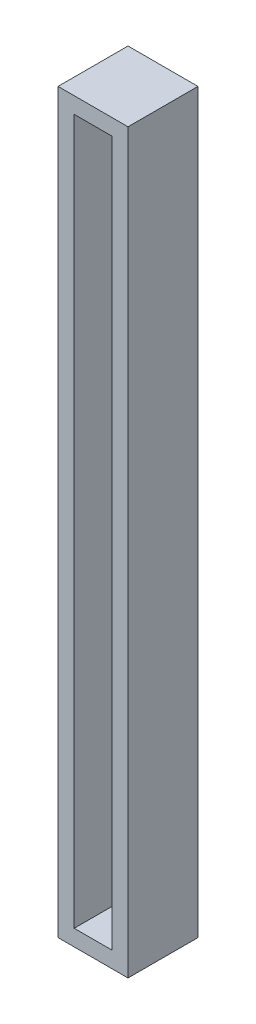
ISO-10303-21;
HEADER;
FILE_DESCRIPTION(('STEP AP214'),'2;1');
FILE_NAME('part.step','',(''),(''),'','','');
FILE_SCHEMA(('AUTOMOTIVE_DESIGN { 1 0 10303 214 1 1 1 1 }'));
ENDSEC;
DATA;
#1=APPLICATION_CONTEXT('core data for automotive mechanical design processes');
#2=APPLICATION_PROTOCOL_DEFINITION('international standard','automotive_design',2000,#1);
#3=PRODUCT_CONTEXT('',#1,'mechanical');
#4=PRODUCT('Part','Part','',(#3));
#5=PRODUCT_RELATED_PRODUCT_CATEGORY('part','',(#4));
#6=PRODUCT_DEFINITION_FORMATION('','',#4);
#7=PRODUCT_DEFINITION_CONTEXT('part definition',#1,'design');
#8=PRODUCT_DEFINITION('design','',#6,#7);
#9=PRODUCT_DEFINITION_SHAPE('','',#8);
#10=(LENGTH_UNIT() NAMED_UNIT(*) SI_UNIT(.MILLI.,.METRE.));
#11=(NAMED_UNIT(*) PLANE_ANGLE_UNIT() SI_UNIT($,.RADIAN.));
#12=(NAMED_UNIT(*) SI_UNIT($,.STERADIAN.) SOLID_ANGLE_UNIT());
#13=UNCERTAINTY_MEASURE_WITH_UNIT(LENGTH_MEASURE(1.E-05),#10,'distance_accuracy_value','');
#14=(GEOMETRIC_REPRESENTATION_CONTEXT(3) GLOBAL_UNCERTAINTY_ASSIGNED_CONTEXT((#13)) GLOBAL_UNIT_ASSIGNED_CONTEXT((#10,
#11,#12)) REPRESENTATION_CONTEXT('',''));
#15=CARTESIAN_POINT('',(0.,0.,0.));
#16=DIRECTION('',(0.,0.,1.));
#17=DIRECTION('',(1.,0.,0.));
#18=AXIS2_PLACEMENT_3D('',#15,#16,#17);
#19=CARTESIAN_POINT('',(0.,0.,6.));
#20=DIRECTION('',(1.,0.,0.));
#21=DIRECTION('',(0.,0.,-1.));
#22=AXIS2_PLACEMENT_3D('',#19,#20,#21);
#23=PLANE('',#22);
#24=CARTESIAN_POINT('',(0.,63.,1.5));
#25=DIRECTION('',(-1.,0.,0.));
#26=DIRECTION('',(0.,0.,-1.));
#27=AXIS2_PLACEMENT_3D('',#24,#25,#26);
#28=CIRCLE('',#27,0.5);
#29=CARTESIAN_POINT('',(0.,62.5,1.5));
#30=VERTEX_POINT('',#29);
#31=CARTESIAN_POINT('',(0.,63.,2.));
#32=VERTEX_POINT('',#31);
#33=EDGE_CURVE('E223',#30,#32,#28,.T.);
#34=ORIENTED_EDGE('',*,*,#33,.F.);
#35=DIRECTION('',(0.,0.,1.));
#36=VECTOR('',#35,1.);
#37=CARTESIAN_POINT('',(0.,62.5,1.));
#38=LINE('',#37,#36);
#39=CARTESIAN_POINT('',(0.,62.5,1.));
#40=VERTEX_POINT('',#39);
#41=EDGE_CURVE('E239',#40,#30,#38,.T.);
#42=ORIENTED_EDGE('',*,*,#41,.F.);
#43=CARTESIAN_POINT('',(0.,63.,1.));
#44=DIRECTION('',(-1.,0.,0.));
#45=DIRECTION('',(0.,0.,1.));
#46=AXIS2_PLACEMENT_3D('',#43,#44,#45);
#47=CIRCLE('',#46,0.5);
#48=CARTESIAN_POINT('',(0.,63.,0.5));
#49=VERTEX_POINT('',#48);
#50=EDGE_CURVE('E280',#49,#40,#47,.T.);
#51=ORIENTED_EDGE('',*,*,#50,.F.);
#52=DIRECTION('',(0.,-1.,0.));
#53=VECTOR('',#52,1.);
#54=CARTESIAN_POINT('',(0.,63.5,0.5));
#55=LINE('',#54,#53);
#56=CARTESIAN_POINT('',(0.,63.5,0.5));
#57=VERTEX_POINT('',#56);
#58=EDGE_CURVE('E276',#57,#49,#55,.T.);
#59=ORIENTED_EDGE('',*,*,#58,.F.);
#60=CARTESIAN_POINT('',(0.,63.5,1.));
#61=DIRECTION('',(-1.,0.,0.));
#62=DIRECTION('',(0.,0.,-1.));
#63=AXIS2_PLACEMENT_3D('',#60,#61,#62);
#64=CIRCLE('',#63,0.5);
#65=CARTESIAN_POINT('',(0.,64.,1.));
#66=VERTEX_POINT('',#65);
#67=EDGE_CURVE('E272',#66,#57,#64,.T.);
#68=ORIENTED_EDGE('',*,*,#67,.F.);
#69=DIRECTION('',(0.,0.,-1.));
#70=VECTOR('',#69,1.);
#71=CARTESIAN_POINT('',(0.,64.,1.));
#72=LINE('',#71,#70);
#73=CARTESIAN_POINT('',(0.,64.,1.5));
#74=VERTEX_POINT('',#73);
#75=EDGE_CURVE('E268',#74,#66,#72,.T.);
#76=ORIENTED_EDGE('',*,*,#75,.F.);
#77=CARTESIAN_POINT('',(0.,63.5,1.5));
#78=DIRECTION('',(-1.,0.,0.));
#79=DIRECTION('',(0.,0.,1.));
#80=AXIS2_PLACEMENT_3D('',#77,#78,#79);
#81=CIRCLE('',#80,0.5);
#82=CARTESIAN_POINT('',(0.,63.5,2.));
#83=VERTEX_POINT('',#82);
#84=EDGE_CURVE('E264',#83,#74,#81,.T.);
#85=ORIENTED_EDGE('',*,*,#84,.F.);
#86=DIRECTION('',(0.,1.,0.));
#87=VECTOR('',#86,1.);
#88=CARTESIAN_POINT('',(0.,63.5,2.));
#89=LINE('',#88,#87);
#90=EDGE_CURVE('E228',#32,#83,#89,.T.);
#91=ORIENTED_EDGE('',*,*,#90,.F.);
#92=EDGE_LOOP('',(#34,#42,#51,#59,#68,#76,#85,#91));
#93=FACE_BOUND('',#92,.T.);
#94=DIRECTION('',(0.,0.,-1.));
#95=VECTOR('',#94,1.);
#96=CARTESIAN_POINT('',(0.,68.5,6.));
#97=LINE('',#96,#95);
#98=CARTESIAN_POINT('',(0.,68.5,6.));
#99=VERTEX_POINT('',#98);
#100=CARTESIAN_POINT('',(0.,68.5,-0.5));
#101=VERTEX_POINT('',#100);
#102=EDGE_CURVE('E391',#99,#101,#97,.T.);
#103=ORIENTED_EDGE('',*,*,#102,.T.);
#104=DIRECTION('',(0.,1.,0.));
#105=VECTOR('',#104,1.);
#106=CARTESIAN_POINT('',(0.,68.5,-0.5));
#107=LINE('',#106,#105);
#108=CARTESIAN_POINT('',(0.,0.,-0.5));
#109=VERTEX_POINT('',#108);
#110=EDGE_CURVE('E326',#109,#101,#107,.T.);
#111=ORIENTED_EDGE('',*,*,#110,.F.);
#112=DIRECTION('',(0.,0.,-1.));
#113=VECTOR('',#112,1.);
#114=CARTESIAN_POINT('',(0.,0.,6.));
#115=LINE('',#114,#113);
#116=CARTESIAN_POINT('',(0.,0.,6.));
#117=VERTEX_POINT('',#116);
#118=EDGE_CURVE('E11',#117,#109,#115,.T.);
#119=ORIENTED_EDGE('',*,*,#118,.F.);
#120=DIRECTION('',(0.,-1.,0.));
#121=VECTOR('',#120,1.);
#122=CARTESIAN_POINT('',(0.,0.,6.));
#123=LINE('',#122,#121);
#124=EDGE_CURVE('E378',#99,#117,#123,.T.);
#125=ORIENTED_EDGE('',*,*,#124,.F.);
#126=EDGE_LOOP('',(#103,#111,#119,#125));
#127=FACE_BOUND('',#126,.T.);
#128=CARTESIAN_POINT('',(0.,5.50000000000001,1.));
#129=DIRECTION('',(-1.,0.,0.));
#130=DIRECTION('',(0.,0.,-1.));
#131=AXIS2_PLACEMENT_3D('',#128,#129,#130);
#132=CIRCLE('',#131,0.5);
#133=CARTESIAN_POINT('',(0.,6.00000000000001,1.));
#134=VERTEX_POINT('',#133);
#135=CARTESIAN_POINT('',(0.,5.50000000000001,0.5));
#136=VERTEX_POINT('',#135);
#137=EDGE_CURVE('E221',#134,#136,#132,.T.);
#138=ORIENTED_EDGE('',*,*,#137,.F.);
#139=DIRECTION('',(0.,0.,-1.));
#140=VECTOR('',#139,1.);
#141=CARTESIAN_POINT('',(0.,6.00000000000001,1.));
#142=LINE('',#141,#140);
#143=CARTESIAN_POINT('',(0.,6.00000000000001,1.5));
#144=VERTEX_POINT('',#143);
#145=EDGE_CURVE('E218',#144,#134,#142,.T.);
#146=ORIENTED_EDGE('',*,*,#145,.F.);
#147=CARTESIAN_POINT('',(0.,5.50000000000001,1.5));
#148=DIRECTION('',(-1.,0.,0.));
#149=DIRECTION('',(0.,0.,1.));
#150=AXIS2_PLACEMENT_3D('',#147,#148,#149);
#151=CIRCLE('',#150,0.5);
#152=CARTESIAN_POINT('',(0.,5.50000000000001,2.));
#153=VERTEX_POINT('',#152);
#154=EDGE_CURVE('E433',#153,#144,#151,.T.);
#155=ORIENTED_EDGE('',*,*,#154,.F.);
#156=DIRECTION('',(0.,1.,0.));
#157=VECTOR('',#156,1.);
#158=CARTESIAN_POINT('',(0.,5.,2.));
#159=LINE('',#158,#157);
#160=CARTESIAN_POINT('',(0.,5.,2.));
#161=VERTEX_POINT('',#160);
#162=EDGE_CURVE('E478',#161,#153,#159,.T.);
#163=ORIENTED_EDGE('',*,*,#162,.F.);
#164=CARTESIAN_POINT('',(0.,5.,1.5));
#165=DIRECTION('',(-1.,0.,0.));
#166=DIRECTION('',(0.,0.,-1.));
#167=AXIS2_PLACEMENT_3D('',#164,#165,#166);
#168=CIRCLE('',#167,0.5);
#169=CARTESIAN_POINT('',(0.,4.5,1.5));
#170=VERTEX_POINT('',#169);
#171=EDGE_CURVE('E471',#170,#161,#168,.T.);
#172=ORIENTED_EDGE('',*,*,#171,.F.);
#173=DIRECTION('',(0.,0.,1.));
#174=VECTOR('',#173,1.);
#175=CARTESIAN_POINT('',(0.,4.5,1.));
#176=LINE('',#175,#174);
#177=CARTESIAN_POINT('',(0.,4.5,1.));
#178=VERTEX_POINT('',#177);
#179=EDGE_CURVE('E463',#178,#170,#176,.T.);
#180=ORIENTED_EDGE('',*,*,#179,.F.);
#181=CARTESIAN_POINT('',(0.,5.,1.));
#182=DIRECTION('',(-1.,0.,0.));
#183=DIRECTION('',(0.,0.,1.));
#184=AXIS2_PLACEMENT_3D('',#181,#182,#183);
#185=CIRCLE('',#184,0.5);
#186=CARTESIAN_POINT('',(0.,5.,0.5));
#187=VERTEX_POINT('',#186);
#188=EDGE_CURVE('E59',#187,#178,#185,.T.);
#189=ORIENTED_EDGE('',*,*,#188,.F.);
#190=DIRECTION('',(0.,-1.,0.));
#191=VECTOR('',#190,1.);
#192=CARTESIAN_POINT('',(0.,5.,0.5));
#193=LINE('',#192,#191);
#194=EDGE_CURVE('E54',#136,#187,#193,.T.);
#195=ORIENTED_EDGE('',*,*,#194,.F.);
#196=EDGE_LOOP('',(#138,#146,#155,#163,#172,#180,#189,#195));
#197=FACE_BOUND('',#196,.T.);
#198=ADVANCED_FACE('F39',(#93,#127,#197),#23,.F.);
#199=CARTESIAN_POINT('',(0.,0.,6.));
#200=DIRECTION('',(0.,0.,-1.));
#201=DIRECTION('',(-1.,0.,0.));
#202=AXIS2_PLACEMENT_3D('',#199,#200,#201);
#203=PLANE('',#202);
#204=ORIENTED_EDGE('',*,*,#124,.T.);
#205=DIRECTION('',(1.,0.,0.));
#206=VECTOR('',#205,1.);
#207=CARTESIAN_POINT('',(0.,0.,6.));
#208=LINE('',#207,#206);
#209=CARTESIAN_POINT('',(6.5,0.,6.));
#210=VERTEX_POINT('',#209);
#211=EDGE_CURVE('E382',#117,#210,#208,.T.);
#212=ORIENTED_EDGE('',*,*,#211,.T.);
#213=DIRECTION('',(0.,1.,0.));
#214=VECTOR('',#213,1.);
#215=CARTESIAN_POINT('',(6.5,0.,6.));
#216=LINE('',#215,#214);
#217=CARTESIAN_POINT('',(6.5,68.5,6.));
#218=VERTEX_POINT('',#217);
#219=EDGE_CURVE('E385',#210,#218,#216,.T.);
#220=ORIENTED_EDGE('',*,*,#219,.T.);
#221=DIRECTION('',(-1.,0.,0.));
#222=VECTOR('',#221,1.);
#223=CARTESIAN_POINT('',(0.,68.5,6.));
#224=LINE('',#223,#222);
#225=EDGE_CURVE('E388',#218,#99,#224,.T.);
#226=ORIENTED_EDGE('',*,*,#225,.T.);
#227=EDGE_LOOP('',(#204,#212,#220,#226));
#228=FACE_BOUND('',#227,.T.);
#229=DIRECTION('',(0.,-1.,0.));
#230=VECTOR('',#229,1.);
#231=CARTESIAN_POINT('',(1.5,1.49999999999999,6.));
#232=LINE('',#231,#230);
#233=CARTESIAN_POINT('',(1.5,67.,6.));
#234=VERTEX_POINT('',#233);
#235=CARTESIAN_POINT('',(1.5,1.49999999999999,6.));
#236=VERTEX_POINT('',#235);
#237=EDGE_CURVE('E335',#234,#236,#232,.T.);
#238=ORIENTED_EDGE('',*,*,#237,.F.);
#239=DIRECTION('',(-1.,0.,0.));
#240=VECTOR('',#239,1.);
#241=CARTESIAN_POINT('',(1.5,67.,6.));
#242=LINE('',#241,#240);
#243=CARTESIAN_POINT('',(5.,67.,6.));
#244=VERTEX_POINT('',#243);
#245=EDGE_CURVE('E346',#244,#234,#242,.T.);
#246=ORIENTED_EDGE('',*,*,#245,.F.);
#247=DIRECTION('',(0.,1.,0.));
#248=VECTOR('',#247,1.);
#249=CARTESIAN_POINT('',(5.,1.49999999999999,6.));
#250=LINE('',#249,#248);
#251=CARTESIAN_POINT('',(5.,1.49999999999999,6.));
#252=VERTEX_POINT('',#251);
#253=EDGE_CURVE('E342',#252,#244,#250,.T.);
#254=ORIENTED_EDGE('',*,*,#253,.F.);
#255=DIRECTION('',(1.,0.,0.));
#256=VECTOR('',#255,1.);
#257=CARTESIAN_POINT('',(1.5,1.49999999999999,6.));
#258=LINE('',#257,#256);
#259=EDGE_CURVE('E338',#236,#252,#258,.T.);
#260=ORIENTED_EDGE('',*,*,#259,.F.);
#261=EDGE_LOOP('',(#238,#246,#254,#260));
#262=FACE_BOUND('',#261,.T.);
#263=ADVANCED_FACE('F417',(#228,#262),#203,.F.);
#264=CARTESIAN_POINT('',(0.,0.,6.));
#265=DIRECTION('',(0.,1.,0.));
#266=DIRECTION('',(0.,0.,1.));
#267=AXIS2_PLACEMENT_3D('',#264,#265,#266);
#268=PLANE('',#267);
#269=ORIENTED_EDGE('',*,*,#118,.T.);
#270=DIRECTION('',(-1.,0.,0.));
#271=VECTOR('',#270,1.);
#272=CARTESIAN_POINT('',(6.5,0.,-0.5));
#273=LINE('',#272,#271);
#274=CARTESIAN_POINT('',(6.5,0.,-0.5));
#275=VERTEX_POINT('',#274);
#276=EDGE_CURVE('E322',#275,#109,#273,.T.);
#277=ORIENTED_EDGE('',*,*,#276,.F.);
#278=DIRECTION('',(0.,0.,-1.));
#279=VECTOR('',#278,1.);
#280=CARTESIAN_POINT('',(6.5,0.,6.));
#281=LINE('',#280,#279);
#282=EDGE_CURVE('E47',#210,#275,#281,.T.);
#283=ORIENTED_EDGE('',*,*,#282,.F.);
#284=ORIENTED_EDGE('',*,*,#211,.F.);
#285=EDGE_LOOP('',(#269,#277,#283,#284));
#286=FACE_BOUND('',#285,.T.);
#287=ADVANCED_FACE('F405',(#286),#268,.F.);
#288=CARTESIAN_POINT('',(6.5,0.,6.));
#289=DIRECTION('',(-1.,0.,0.));
#290=DIRECTION('',(0.,0.,1.));
#291=AXIS2_PLACEMENT_3D('',#288,#289,#290);
#292=PLANE('',#291);
#293=ORIENTED_EDGE('',*,*,#282,.T.);
#294=DIRECTION('',(0.,-1.,0.));
#295=VECTOR('',#294,1.);
#296=CARTESIAN_POINT('',(6.5,68.5,-0.5));
#297=LINE('',#296,#295);
#298=CARTESIAN_POINT('',(6.5,68.5,-0.5));
#299=VERTEX_POINT('',#298);
#300=EDGE_CURVE('E318',#299,#275,#297,.T.);
#301=ORIENTED_EDGE('',*,*,#300,.F.);
#302=DIRECTION('',(0.,0.,-1.));
#303=VECTOR('',#302,1.);
#304=CARTESIAN_POINT('',(6.5,68.5,6.));
#305=LINE('',#304,#303);
#306=EDGE_CURVE('E394',#218,#299,#305,.T.);
#307=ORIENTED_EDGE('',*,*,#306,.F.);
#308=ORIENTED_EDGE('',*,*,#219,.F.);
#309=EDGE_LOOP('',(#293,#301,#307,#308));
#310=FACE_BOUND('',#309,.T.);
#311=ADVANCED_FACE('F402',(#310),#292,.F.);
#312=CARTESIAN_POINT('',(0.,68.5,6.));
#313=DIRECTION('',(0.,-1.,0.));
#314=DIRECTION('',(0.,0.,-1.));
#315=AXIS2_PLACEMENT_3D('',#312,#313,#314);
#316=PLANE('',#315);
#317=ORIENTED_EDGE('',*,*,#306,.T.);
#318=DIRECTION('',(1.,0.,0.));
#319=VECTOR('',#318,1.);
#320=CARTESIAN_POINT('',(6.5,68.5,-0.5));
#321=LINE('',#320,#319);
#322=EDGE_CURVE('E330',#101,#299,#321,.T.);
#323=ORIENTED_EDGE('',*,*,#322,.F.);
#324=ORIENTED_EDGE('',*,*,#102,.F.);
#325=ORIENTED_EDGE('',*,*,#225,.F.);
#326=EDGE_LOOP('',(#317,#323,#324,#325));
#327=FACE_BOUND('',#326,.T.);
#328=ADVANCED_FACE('F413',(#327),#316,.F.);
#329=CARTESIAN_POINT('',(1.5,1.49999999999999,6.));
#330=DIRECTION('',(1.,0.,0.));
#331=DIRECTION('',(0.,0.,-1.));
#332=AXIS2_PLACEMENT_3D('',#329,#330,#331);
#333=PLANE('',#332);
#334=DIRECTION('',(0.,-1.,0.));
#335=VECTOR('',#334,1.);
#336=CARTESIAN_POINT('',(1.5,1.49999999999999,0.));
#337=LINE('',#336,#335);
#338=CARTESIAN_POINT('',(1.5,67.,0.));
#339=VERTEX_POINT('',#338);
#340=CARTESIAN_POINT('',(1.5,1.49999999999999,0.));
#341=VERTEX_POINT('',#340);
#342=EDGE_CURVE('E334',#339,#341,#337,.T.);
#343=ORIENTED_EDGE('',*,*,#342,.F.);
#344=DIRECTION('',(0.,0.,-1.));
#345=VECTOR('',#344,1.);
#346=CARTESIAN_POINT('',(1.5,67.,6.));
#347=LINE('',#346,#345);
#348=EDGE_CURVE('E349',#234,#339,#347,.T.);
#349=ORIENTED_EDGE('',*,*,#348,.F.);
#350=ORIENTED_EDGE('',*,*,#237,.T.);
#351=DIRECTION('',(0.,0.,-1.));
#352=VECTOR('',#351,1.);
#353=CARTESIAN_POINT('',(1.5,1.49999999999999,6.));
#354=LINE('',#353,#352);
#355=EDGE_CURVE('E374',#236,#341,#354,.T.);
#356=ORIENTED_EDGE('',*,*,#355,.T.);
#357=EDGE_LOOP('',(#343,#349,#350,#356));
#358=FACE_BOUND('',#357,.T.);
#359=ADVANCED_FACE('F574',(#358),#333,.T.);
#360=CARTESIAN_POINT('',(1.5,1.49999999999999,6.));
#361=DIRECTION('',(0.,1.,0.));
#362=DIRECTION('',(0.,0.,1.));
#363=AXIS2_PLACEMENT_3D('',#360,#361,#362);
#364=PLANE('',#363);
#365=DIRECTION('',(1.,0.,0.));
#366=VECTOR('',#365,1.);
#367=CARTESIAN_POINT('',(1.5,1.49999999999999,0.));
#368=LINE('',#367,#366);
#369=CARTESIAN_POINT('',(5.,1.49999999999999,0.));
#370=VERTEX_POINT('',#369);
#371=EDGE_CURVE('E353',#341,#370,#368,.T.);
#372=ORIENTED_EDGE('',*,*,#371,.F.);
#373=ORIENTED_EDGE('',*,*,#355,.F.);
#374=ORIENTED_EDGE('',*,*,#259,.T.);
#375=DIRECTION('',(0.,0.,-1.));
#376=VECTOR('',#375,1.);
#377=CARTESIAN_POINT('',(5.,1.49999999999999,6.));
#378=LINE('',#377,#376);
#379=EDGE_CURVE('E371',#252,#370,#378,.T.);
#380=ORIENTED_EDGE('',*,*,#379,.T.);
#381=EDGE_LOOP('',(#372,#373,#374,#380));
#382=FACE_BOUND('',#381,.T.);
#383=ADVANCED_FACE('F570',(#382),#364,.T.);
#384=CARTESIAN_POINT('',(5.,1.49999999999999,6.));
#385=DIRECTION('',(-1.,0.,0.));
#386=DIRECTION('',(0.,0.,1.));
#387=AXIS2_PLACEMENT_3D('',#384,#385,#386);
#388=PLANE('',#387);
#389=DIRECTION('',(0.,1.,0.));
#390=VECTOR('',#389,1.);
#391=CARTESIAN_POINT('',(5.,1.49999999999999,0.));
#392=LINE('',#391,#390);
#393=CARTESIAN_POINT('',(5.,67.,0.));
#394=VERTEX_POINT('',#393);
#395=EDGE_CURVE('E357',#370,#394,#392,.T.);
#396=ORIENTED_EDGE('',*,*,#395,.F.);
#397=ORIENTED_EDGE('',*,*,#379,.F.);
#398=ORIENTED_EDGE('',*,*,#253,.T.);
#399=DIRECTION('',(0.,0.,-1.));
#400=VECTOR('',#399,1.);
#401=CARTESIAN_POINT('',(5.,67.,6.));
#402=LINE('',#401,#400);
#403=EDGE_CURVE('E367',#244,#394,#402,.T.);
#404=ORIENTED_EDGE('',*,*,#403,.T.);
#405=EDGE_LOOP('',(#396,#397,#398,#404));
#406=FACE_BOUND('',#405,.T.);
#407=ADVANCED_FACE('F566',(#406),#388,.T.);
#408=CARTESIAN_POINT('',(1.5,67.,6.));
#409=DIRECTION('',(0.,-1.,0.));
#410=DIRECTION('',(0.,0.,-1.));
#411=AXIS2_PLACEMENT_3D('',#408,#409,#410);
#412=PLANE('',#411);
#413=DIRECTION('',(-1.,0.,0.));
#414=VECTOR('',#413,1.);
#415=CARTESIAN_POINT('',(1.5,67.,0.));
#416=LINE('',#415,#414);
#417=EDGE_CURVE('E339',#394,#339,#416,.T.);
#418=ORIENTED_EDGE('',*,*,#417,.F.);
#419=ORIENTED_EDGE('',*,*,#403,.F.);
#420=ORIENTED_EDGE('',*,*,#245,.T.);
#421=ORIENTED_EDGE('',*,*,#348,.T.);
#422=EDGE_LOOP('',(#418,#419,#420,#421));
#423=FACE_BOUND('',#422,.T.);
#424=ADVANCED_FACE('F562',(#423),#412,.T.);
#425=CARTESIAN_POINT('',(0.,0.,0.));
#426=DIRECTION('',(0.,0.,-1.));
#427=DIRECTION('',(-1.,0.,0.));
#428=AXIS2_PLACEMENT_3D('',#425,#426,#427);
#429=PLANE('',#428);
#430=ORIENTED_EDGE('',*,*,#395,.T.);
#431=ORIENTED_EDGE('',*,*,#417,.T.);
#432=ORIENTED_EDGE('',*,*,#342,.T.);
#433=ORIENTED_EDGE('',*,*,#371,.T.);
#434=EDGE_LOOP('',(#430,#431,#432,#433));
#435=FACE_BOUND('',#434,.T.);
#436=ADVANCED_FACE('F559',(#435),#429,.F.);
#437=CARTESIAN_POINT('',(0.,0.,-0.5));
#438=DIRECTION('',(0.,0.,-1.));
#439=DIRECTION('',(-1.,0.,0.));
#440=AXIS2_PLACEMENT_3D('',#437,#438,#439);
#441=PLANE('',#440);
#442=ORIENTED_EDGE('',*,*,#300,.T.);
#443=ORIENTED_EDGE('',*,*,#276,.T.);
#444=ORIENTED_EDGE('',*,*,#110,.T.);
#445=ORIENTED_EDGE('',*,*,#322,.T.);
#446=EDGE_LOOP('',(#442,#443,#444,#445));
#447=FACE_BOUND('',#446,.T.);
#448=ADVANCED_FACE('F409',(#447),#441,.T.);
#449=CARTESIAN_POINT('',(-1.,63.,1.5));
#450=DIRECTION('',(1.,0.,0.));
#451=DIRECTION('',(0.,0.,-1.));
#452=AXIS2_PLACEMENT_3D('',#449,#450,#451);
#453=CYLINDRICAL_SURFACE('',#452,0.5);
#454=ORIENTED_EDGE('',*,*,#33,.T.);
#455=DIRECTION('',(1.,0.,0.));
#456=VECTOR('',#455,1.);
#457=CARTESIAN_POINT('',(-1.,63.,2.));
#458=LINE('',#457,#456);
#459=CARTESIAN_POINT('',(-1.,63.,2.));
#460=VERTEX_POINT('',#459);
#461=EDGE_CURVE('E314',#460,#32,#458,.T.);
#462=ORIENTED_EDGE('',*,*,#461,.F.);
#463=CARTESIAN_POINT('',(-1.,63.,1.5));
#464=DIRECTION('',(-1.,0.,0.));
#465=DIRECTION('',(0.,0.,-1.));
#466=AXIS2_PLACEMENT_3D('',#463,#464,#465);
#467=CIRCLE('',#466,0.5);
#468=CARTESIAN_POINT('',(-1.,62.5,1.5));
#469=VERTEX_POINT('',#468);
#470=EDGE_CURVE('E234',#469,#460,#467,.T.);
#471=ORIENTED_EDGE('',*,*,#470,.F.);
#472=DIRECTION('',(1.,0.,0.));
#473=VECTOR('',#472,1.);
#474=CARTESIAN_POINT('',(-1.,62.5,1.5));
#475=LINE('',#474,#473);
#476=EDGE_CURVE('E259',#469,#30,#475,.T.);
#477=ORIENTED_EDGE('',*,*,#476,.T.);
#478=EDGE_LOOP('',(#454,#462,#471,#477));
#479=FACE_BOUND('',#478,.T.);
#480=ADVANCED_FACE('F552',(#479),#453,.T.);
#481=CARTESIAN_POINT('',(-1.,63.5,2.));
#482=DIRECTION('',(0.,0.,-1.));
#483=DIRECTION('',(-1.,0.,0.));
#484=AXIS2_PLACEMENT_3D('',#481,#482,#483);
#485=PLANE('',#484);
#486=ORIENTED_EDGE('',*,*,#90,.T.);
#487=DIRECTION('',(1.,0.,0.));
#488=VECTOR('',#487,1.);
#489=CARTESIAN_POINT('',(-1.,63.5,2.));
#490=LINE('',#489,#488);
#491=CARTESIAN_POINT('',(-1.,63.5,2.));
#492=VERTEX_POINT('',#491);
#493=EDGE_CURVE('E310',#492,#83,#490,.T.);
#494=ORIENTED_EDGE('',*,*,#493,.F.);
#495=DIRECTION('',(0.,1.,0.));
#496=VECTOR('',#495,1.);
#497=CARTESIAN_POINT('',(-1.,63.5,2.));
#498=LINE('',#497,#496);
#499=EDGE_CURVE('E238',#460,#492,#498,.T.);
#500=ORIENTED_EDGE('',*,*,#499,.F.);
#501=ORIENTED_EDGE('',*,*,#461,.T.);
#502=EDGE_LOOP('',(#486,#494,#500,#501));
#503=FACE_BOUND('',#502,.T.);
#504=ADVANCED_FACE('F548',(#503),#485,.F.);
#505=CARTESIAN_POINT('',(-1.,63.5,1.5));
#506=DIRECTION('',(1.,0.,0.));
#507=DIRECTION('',(0.,0.,-1.));
#508=AXIS2_PLACEMENT_3D('',#505,#506,#507);
#509=CYLINDRICAL_SURFACE('',#508,0.5);
#510=ORIENTED_EDGE('',*,*,#84,.T.);
#511=DIRECTION('',(1.,0.,0.));
#512=VECTOR('',#511,1.);
#513=CARTESIAN_POINT('',(-1.,64.,1.5));
#514=LINE('',#513,#512);
#515=CARTESIAN_POINT('',(-1.,64.,1.5));
#516=VERTEX_POINT('',#515);
#517=EDGE_CURVE('E306',#516,#74,#514,.T.);
#518=ORIENTED_EDGE('',*,*,#517,.F.);
#519=CARTESIAN_POINT('',(-1.,63.5,1.5));
#520=DIRECTION('',(-1.,0.,0.));
#521=DIRECTION('',(0.,0.,1.));
#522=AXIS2_PLACEMENT_3D('',#519,#520,#521);
#523=CIRCLE('',#522,0.5);
#524=EDGE_CURVE('E242',#492,#516,#523,.T.);
#525=ORIENTED_EDGE('',*,*,#524,.F.);
#526=ORIENTED_EDGE('',*,*,#493,.T.);
#527=EDGE_LOOP('',(#510,#518,#525,#526));
#528=FACE_BOUND('',#527,.T.);
#529=ADVANCED_FACE('F544',(#528),#509,.T.);
#530=CARTESIAN_POINT('',(-1.,64.,1.));
#531=DIRECTION('',(0.,-1.,0.));
#532=DIRECTION('',(0.,0.,-1.));
#533=AXIS2_PLACEMENT_3D('',#530,#531,#532);
#534=PLANE('',#533);
#535=ORIENTED_EDGE('',*,*,#75,.T.);
#536=DIRECTION('',(1.,0.,0.));
#537=VECTOR('',#536,1.);
#538=CARTESIAN_POINT('',(-1.,64.,1.));
#539=LINE('',#538,#537);
#540=CARTESIAN_POINT('',(-1.,64.,1.));
#541=VERTEX_POINT('',#540);
#542=EDGE_CURVE('E302',#541,#66,#539,.T.);
#543=ORIENTED_EDGE('',*,*,#542,.F.);
#544=DIRECTION('',(0.,0.,-1.));
#545=VECTOR('',#544,1.);
#546=CARTESIAN_POINT('',(-1.,64.,1.));
#547=LINE('',#546,#545);
#548=EDGE_CURVE('E245',#516,#541,#547,.T.);
#549=ORIENTED_EDGE('',*,*,#548,.F.);
#550=ORIENTED_EDGE('',*,*,#517,.T.);
#551=EDGE_LOOP('',(#535,#543,#549,#550));
#552=FACE_BOUND('',#551,.T.);
#553=ADVANCED_FACE('F540',(#552),#534,.F.);
#554=CARTESIAN_POINT('',(-1.,63.5,1.));
#555=DIRECTION('',(1.,0.,0.));
#556=DIRECTION('',(0.,0.,-1.));
#557=AXIS2_PLACEMENT_3D('',#554,#555,#556);
#558=CYLINDRICAL_SURFACE('',#557,0.5);
#559=ORIENTED_EDGE('',*,*,#67,.T.);
#560=DIRECTION('',(1.,0.,0.));
#561=VECTOR('',#560,1.);
#562=CARTESIAN_POINT('',(-1.,63.5,0.5));
#563=LINE('',#562,#561);
#564=CARTESIAN_POINT('',(-1.,63.5,0.5));
#565=VERTEX_POINT('',#564);
#566=EDGE_CURVE('E298',#565,#57,#563,.T.);
#567=ORIENTED_EDGE('',*,*,#566,.F.);
#568=CARTESIAN_POINT('',(-1.,63.5,1.));
#569=DIRECTION('',(-1.,0.,0.));
#570=DIRECTION('',(0.,0.,-1.));
#571=AXIS2_PLACEMENT_3D('',#568,#569,#570);
#572=CIRCLE('',#571,0.5);
#573=EDGE_CURVE('E248',#541,#565,#572,.T.);
#574=ORIENTED_EDGE('',*,*,#573,.F.);
#575=ORIENTED_EDGE('',*,*,#542,.T.);
#576=EDGE_LOOP('',(#559,#567,#574,#575));
#577=FACE_BOUND('',#576,.T.);
#578=ADVANCED_FACE('F536',(#577),#558,.T.);
#579=CARTESIAN_POINT('',(-1.,63.5,0.5));
#580=DIRECTION('',(0.,0.,1.));
#581=DIRECTION('',(1.,0.,0.));
#582=AXIS2_PLACEMENT_3D('',#579,#580,#581);
#583=PLANE('',#582);
#584=ORIENTED_EDGE('',*,*,#58,.T.);
#585=DIRECTION('',(1.,0.,0.));
#586=VECTOR('',#585,1.);
#587=CARTESIAN_POINT('',(-1.,63.,0.5));
#588=LINE('',#587,#586);
#589=CARTESIAN_POINT('',(-1.,63.,0.5));
#590=VERTEX_POINT('',#589);
#591=EDGE_CURVE('E294',#590,#49,#588,.T.);
#592=ORIENTED_EDGE('',*,*,#591,.F.);
#593=DIRECTION('',(0.,-1.,0.));
#594=VECTOR('',#593,1.);
#595=CARTESIAN_POINT('',(-1.,63.5,0.5));
#596=LINE('',#595,#594);
#597=EDGE_CURVE('E251',#565,#590,#596,.T.);
#598=ORIENTED_EDGE('',*,*,#597,.F.);
#599=ORIENTED_EDGE('',*,*,#566,.T.);
#600=EDGE_LOOP('',(#584,#592,#598,#599));
#601=FACE_BOUND('',#600,.T.);
#602=ADVANCED_FACE('F532',(#601),#583,.F.);
#603=CARTESIAN_POINT('',(-1.,63.,1.));
#604=DIRECTION('',(1.,0.,0.));
#605=DIRECTION('',(0.,0.,-1.));
#606=AXIS2_PLACEMENT_3D('',#603,#604,#605);
#607=CYLINDRICAL_SURFACE('',#606,0.5);
#608=ORIENTED_EDGE('',*,*,#50,.T.);
#609=DIRECTION('',(1.,0.,0.));
#610=VECTOR('',#609,1.);
#611=CARTESIAN_POINT('',(-1.,62.5,1.));
#612=LINE('',#611,#610);
#613=CARTESIAN_POINT('',(-1.,62.5,1.));
#614=VERTEX_POINT('',#613);
#615=EDGE_CURVE('E290',#614,#40,#612,.T.);
#616=ORIENTED_EDGE('',*,*,#615,.F.);
#617=CARTESIAN_POINT('',(-1.,63.,1.));
#618=DIRECTION('',(-1.,0.,0.));
#619=DIRECTION('',(0.,0.,1.));
#620=AXIS2_PLACEMENT_3D('',#617,#618,#619);
#621=CIRCLE('',#620,0.5);
#622=EDGE_CURVE('E254',#590,#614,#621,.T.);
#623=ORIENTED_EDGE('',*,*,#622,.F.);
#624=ORIENTED_EDGE('',*,*,#591,.T.);
#625=EDGE_LOOP('',(#608,#616,#623,#624));
#626=FACE_BOUND('',#625,.T.);
#627=ADVANCED_FACE('F528',(#626),#607,.T.);
#628=CARTESIAN_POINT('',(-1.,62.5,1.));
#629=DIRECTION('',(0.,1.,0.));
#630=DIRECTION('',(0.,0.,1.));
#631=AXIS2_PLACEMENT_3D('',#628,#629,#630);
#632=PLANE('',#631);
#633=ORIENTED_EDGE('',*,*,#41,.T.);
#634=ORIENTED_EDGE('',*,*,#476,.F.);
#635=DIRECTION('',(0.,0.,1.));
#636=VECTOR('',#635,1.);
#637=CARTESIAN_POINT('',(-1.,62.5,1.));
#638=LINE('',#637,#636);
#639=EDGE_CURVE('E257',#614,#469,#638,.T.);
#640=ORIENTED_EDGE('',*,*,#639,.F.);
#641=ORIENTED_EDGE('',*,*,#615,.T.);
#642=EDGE_LOOP('',(#633,#634,#640,#641));
#643=FACE_BOUND('',#642,.T.);
#644=ADVANCED_FACE('F524',(#643),#632,.F.);
#645=CARTESIAN_POINT('',(-1.,63.,1.5));
#646=DIRECTION('',(1.,0.,0.));
#647=DIRECTION('',(0.,0.,-1.));
#648=AXIS2_PLACEMENT_3D('',#645,#646,#647);
#649=PLANE('',#648);
#650=ORIENTED_EDGE('',*,*,#470,.T.);
#651=ORIENTED_EDGE('',*,*,#499,.T.);
#652=ORIENTED_EDGE('',*,*,#524,.T.);
#653=ORIENTED_EDGE('',*,*,#548,.T.);
#654=ORIENTED_EDGE('',*,*,#573,.T.);
#655=ORIENTED_EDGE('',*,*,#597,.T.);
#656=ORIENTED_EDGE('',*,*,#622,.T.);
#657=ORIENTED_EDGE('',*,*,#639,.T.);
#658=EDGE_LOOP('',(#650,#651,#652,#653,#654,#655,#656,#657));
#659=FACE_BOUND('',#658,.T.);
#660=ADVANCED_FACE('F521',(#659),#649,.F.);
#661=CARTESIAN_POINT('',(-1.,5.50000000000001,1.));
#662=DIRECTION('',(1.,0.,0.));
#663=DIRECTION('',(0.,0.,-1.));
#664=AXIS2_PLACEMENT_3D('',#661,#662,#663);
#665=CYLINDRICAL_SURFACE('',#664,0.5);
#666=ORIENTED_EDGE('',*,*,#137,.T.);
#667=DIRECTION('',(1.,0.,0.));
#668=VECTOR('',#667,1.);
#669=CARTESIAN_POINT('',(-1.,5.50000000000001,0.5));
#670=LINE('',#669,#668);
#671=CARTESIAN_POINT('',(-1.,5.50000000000001,0.5));
#672=VERTEX_POINT('',#671);
#673=EDGE_CURVE('E200',#672,#136,#670,.T.);
#674=ORIENTED_EDGE('',*,*,#673,.F.);
#675=CARTESIAN_POINT('',(-1.,5.50000000000001,1.));
#676=DIRECTION('',(-1.,0.,0.));
#677=DIRECTION('',(0.,0.,-1.));
#678=AXIS2_PLACEMENT_3D('',#675,#676,#677);
#679=CIRCLE('',#678,0.5);
#680=CARTESIAN_POINT('',(-1.,6.00000000000001,1.));
#681=VERTEX_POINT('',#680);
#682=EDGE_CURVE('E208',#681,#672,#679,.T.);
#683=ORIENTED_EDGE('',*,*,#682,.F.);
#684=DIRECTION('',(1.,0.,0.));
#685=VECTOR('',#684,1.);
#686=CARTESIAN_POINT('',(-1.,6.00000000000001,1.));
#687=LINE('',#686,#685);
#688=EDGE_CURVE('E429',#681,#134,#687,.T.);
#689=ORIENTED_EDGE('',*,*,#688,.T.);
#690=EDGE_LOOP('',(#666,#674,#683,#689));
#691=FACE_BOUND('',#690,.T.);
#692=ADVANCED_FACE('F220',(#691),#665,.T.);
#693=CARTESIAN_POINT('',(-1.,5.,0.5));
#694=DIRECTION('',(0.,0.,1.));
#695=DIRECTION('',(1.,0.,0.));
#696=AXIS2_PLACEMENT_3D('',#693,#694,#695);
#697=PLANE('',#696);
#698=ORIENTED_EDGE('',*,*,#194,.T.);
#699=DIRECTION('',(1.,0.,0.));
#700=VECTOR('',#699,1.);
#701=CARTESIAN_POINT('',(-1.,5.,0.5));
#702=LINE('',#701,#700);
#703=CARTESIAN_POINT('',(-1.,5.,0.5));
#704=VERTEX_POINT('',#703);
#705=EDGE_CURVE('E203',#704,#187,#702,.T.);
#706=ORIENTED_EDGE('',*,*,#705,.F.);
#707=DIRECTION('',(0.,-1.,0.));
#708=VECTOR('',#707,1.);
#709=CARTESIAN_POINT('',(-1.,5.,0.5));
#710=LINE('',#709,#708);
#711=EDGE_CURVE('E196',#672,#704,#710,.T.);
#712=ORIENTED_EDGE('',*,*,#711,.F.);
#713=ORIENTED_EDGE('',*,*,#673,.T.);
#714=EDGE_LOOP('',(#698,#706,#712,#713));
#715=FACE_BOUND('',#714,.T.);
#716=ADVANCED_FACE('F198',(#715),#697,.F.);
#717=CARTESIAN_POINT('',(-1.,5.,1.));
#718=DIRECTION('',(1.,0.,0.));
#719=DIRECTION('',(0.,0.,-1.));
#720=AXIS2_PLACEMENT_3D('',#717,#718,#719);
#721=CYLINDRICAL_SURFACE('',#720,0.5);
#722=ORIENTED_EDGE('',*,*,#188,.T.);
#723=DIRECTION('',(1.,0.,0.));
#724=VECTOR('',#723,1.);
#725=CARTESIAN_POINT('',(-1.,4.5,1.));
#726=LINE('',#725,#724);
#727=CARTESIAN_POINT('',(-1.,4.5,1.));
#728=VERTEX_POINT('',#727);
#729=EDGE_CURVE('E230',#728,#178,#726,.T.);
#730=ORIENTED_EDGE('',*,*,#729,.F.);
#731=CARTESIAN_POINT('',(-1.,5.,1.));
#732=DIRECTION('',(-1.,0.,0.));
#733=DIRECTION('',(0.,0.,1.));
#734=AXIS2_PLACEMENT_3D('',#731,#732,#733);
#735=CIRCLE('',#734,0.5);
#736=EDGE_CURVE('E207',#704,#728,#735,.T.);
#737=ORIENTED_EDGE('',*,*,#736,.F.);
#738=ORIENTED_EDGE('',*,*,#705,.T.);
#739=EDGE_LOOP('',(#722,#730,#737,#738));
#740=FACE_BOUND('',#739,.T.);
#741=ADVANCED_FACE('F466',(#740),#721,.T.);
#742=CARTESIAN_POINT('',(-1.,4.5,1.));
#743=DIRECTION('',(0.,1.,0.));
#744=DIRECTION('',(0.,0.,1.));
#745=AXIS2_PLACEMENT_3D('',#742,#743,#744);
#746=PLANE('',#745);
#747=ORIENTED_EDGE('',*,*,#179,.T.);
#748=DIRECTION('',(1.,0.,0.));
#749=VECTOR('',#748,1.);
#750=CARTESIAN_POINT('',(-1.,4.5,1.5));
#751=LINE('',#750,#749);
#752=CARTESIAN_POINT('',(-1.,4.5,1.5));
#753=VERTEX_POINT('',#752);
#754=EDGE_CURVE('E452',#753,#170,#751,.T.);
#755=ORIENTED_EDGE('',*,*,#754,.F.);
#756=DIRECTION('',(0.,0.,1.));
#757=VECTOR('',#756,1.);
#758=CARTESIAN_POINT('',(-1.,4.5,1.));
#759=LINE('',#758,#757);
#760=EDGE_CURVE('E464',#728,#753,#759,.T.);
#761=ORIENTED_EDGE('',*,*,#760,.F.);
#762=ORIENTED_EDGE('',*,*,#729,.T.);
#763=EDGE_LOOP('',(#747,#755,#761,#762));
#764=FACE_BOUND('',#763,.T.);
#765=ADVANCED_FACE('F461',(#764),#746,.F.);
#766=CARTESIAN_POINT('',(-1.,5.,1.5));
#767=DIRECTION('',(1.,0.,0.));
#768=DIRECTION('',(0.,0.,-1.));
#769=AXIS2_PLACEMENT_3D('',#766,#767,#768);
#770=CYLINDRICAL_SURFACE('',#769,0.5);
#771=ORIENTED_EDGE('',*,*,#171,.T.);
#772=DIRECTION('',(1.,0.,0.));
#773=VECTOR('',#772,1.);
#774=CARTESIAN_POINT('',(-1.,5.,2.));
#775=LINE('',#774,#773);
#776=CARTESIAN_POINT('',(-1.,5.,2.));
#777=VERTEX_POINT('',#776);
#778=EDGE_CURVE('E448',#777,#161,#775,.T.);
#779=ORIENTED_EDGE('',*,*,#778,.F.);
#780=CARTESIAN_POINT('',(-1.,5.,1.5));
#781=DIRECTION('',(-1.,0.,0.));
#782=DIRECTION('',(0.,0.,-1.));
#783=AXIS2_PLACEMENT_3D('',#780,#781,#782);
#784=CIRCLE('',#783,0.5);
#785=EDGE_CURVE('E494',#753,#777,#784,.T.);
#786=ORIENTED_EDGE('',*,*,#785,.F.);
#787=ORIENTED_EDGE('',*,*,#754,.T.);
#788=EDGE_LOOP('',(#771,#779,#786,#787));
#789=FACE_BOUND('',#788,.T.);
#790=ADVANCED_FACE('F493',(#789),#770,.T.);
#791=CARTESIAN_POINT('',(-1.,5.,2.));
#792=DIRECTION('',(0.,0.,-1.));
#793=DIRECTION('',(-1.,0.,0.));
#794=AXIS2_PLACEMENT_3D('',#791,#792,#793);
#795=PLANE('',#794);
#796=ORIENTED_EDGE('',*,*,#162,.T.);
#797=DIRECTION('',(1.,0.,0.));
#798=VECTOR('',#797,1.);
#799=CARTESIAN_POINT('',(-1.,5.50000000000001,2.));
#800=LINE('',#799,#798);
#801=CARTESIAN_POINT('',(-1.,5.50000000000001,2.));
#802=VERTEX_POINT('',#801);
#803=EDGE_CURVE('E439',#802,#153,#800,.T.);
#804=ORIENTED_EDGE('',*,*,#803,.F.);
#805=DIRECTION('',(0.,1.,0.));
#806=VECTOR('',#805,1.);
#807=CARTESIAN_POINT('',(-1.,5.,2.));
#808=LINE('',#807,#806);
#809=EDGE_CURVE('E490',#777,#802,#808,.T.);
#810=ORIENTED_EDGE('',*,*,#809,.F.);
#811=ORIENTED_EDGE('',*,*,#778,.T.);
#812=EDGE_LOOP('',(#796,#804,#810,#811));
#813=FACE_BOUND('',#812,.T.);
#814=ADVANCED_FACE('F487',(#813),#795,.F.);
#815=CARTESIAN_POINT('',(-1.,5.50000000000001,1.5));
#816=DIRECTION('',(1.,0.,0.));
#817=DIRECTION('',(0.,0.,-1.));
#818=AXIS2_PLACEMENT_3D('',#815,#816,#817);
#819=CYLINDRICAL_SURFACE('',#818,0.5);
#820=ORIENTED_EDGE('',*,*,#154,.T.);
#821=DIRECTION('',(1.,0.,0.));
#822=VECTOR('',#821,1.);
#823=CARTESIAN_POINT('',(-1.,6.00000000000001,1.5));
#824=LINE('',#823,#822);
#825=CARTESIAN_POINT('',(-1.,6.00000000000001,1.5));
#826=VERTEX_POINT('',#825);
#827=EDGE_CURVE('E431',#826,#144,#824,.T.);
#828=ORIENTED_EDGE('',*,*,#827,.F.);
#829=CARTESIAN_POINT('',(-1.,5.50000000000001,1.5));
#830=DIRECTION('',(-1.,0.,0.));
#831=DIRECTION('',(0.,0.,1.));
#832=AXIS2_PLACEMENT_3D('',#829,#830,#831);
#833=CIRCLE('',#832,0.5);
#834=EDGE_CURVE('E441',#802,#826,#833,.T.);
#835=ORIENTED_EDGE('',*,*,#834,.F.);
#836=ORIENTED_EDGE('',*,*,#803,.T.);
#837=EDGE_LOOP('',(#820,#828,#835,#836));
#838=FACE_BOUND('',#837,.T.);
#839=ADVANCED_FACE('F483',(#838),#819,.T.);
#840=CARTESIAN_POINT('',(-1.,6.00000000000001,1.));
#841=DIRECTION('',(0.,-1.,0.));
#842=DIRECTION('',(0.,0.,-1.));
#843=AXIS2_PLACEMENT_3D('',#840,#841,#842);
#844=PLANE('',#843);
#845=ORIENTED_EDGE('',*,*,#145,.T.);
#846=ORIENTED_EDGE('',*,*,#688,.F.);
#847=DIRECTION('',(0.,0.,-1.));
#848=VECTOR('',#847,1.);
#849=CARTESIAN_POINT('',(-1.,6.00000000000001,1.));
#850=LINE('',#849,#848);
#851=EDGE_CURVE('E213',#826,#681,#850,.T.);
#852=ORIENTED_EDGE('',*,*,#851,.F.);
#853=ORIENTED_EDGE('',*,*,#827,.T.);
#854=EDGE_LOOP('',(#845,#846,#852,#853));
#855=FACE_BOUND('',#854,.T.);
#856=ADVANCED_FACE('F428',(#855),#844,.F.);
#857=CARTESIAN_POINT('',(-1.,5.50000000000001,1.));
#858=DIRECTION('',(1.,0.,0.));
#859=DIRECTION('',(0.,0.,-1.));
#860=AXIS2_PLACEMENT_3D('',#857,#858,#859);
#861=PLANE('',#860);
#862=ORIENTED_EDGE('',*,*,#682,.T.);
#863=ORIENTED_EDGE('',*,*,#711,.T.);
#864=ORIENTED_EDGE('',*,*,#736,.T.);
#865=ORIENTED_EDGE('',*,*,#760,.T.);
#866=ORIENTED_EDGE('',*,*,#785,.T.);
#867=ORIENTED_EDGE('',*,*,#809,.T.);
#868=ORIENTED_EDGE('',*,*,#834,.T.);
#869=ORIENTED_EDGE('',*,*,#851,.T.);
#870=EDGE_LOOP('',(#862,#863,#864,#865,#866,#867,#868,#869));
#871=FACE_BOUND('',#870,.T.);
#872=ADVANCED_FACE('F211',(#871),#861,.F.);
#873=CLOSED_SHELL('',(#198,#263,#287,#311,#328,#359,#383,#407,#424,#436,#448,#480,#504,#529,
#553,#578,#602,#627,#644,#660,#692,#716,#741,#765,#790,#814,#839,#856,#872));
#874=MANIFOLD_SOLID_BREP('B2',#873);
#875=ADVANCED_BREP_SHAPE_REPRESENTATION('',(#18,#874),#14);
#876=SHAPE_DEFINITION_REPRESENTATION(#9,#875);
ENDSEC;
END-ISO-10303-21;
